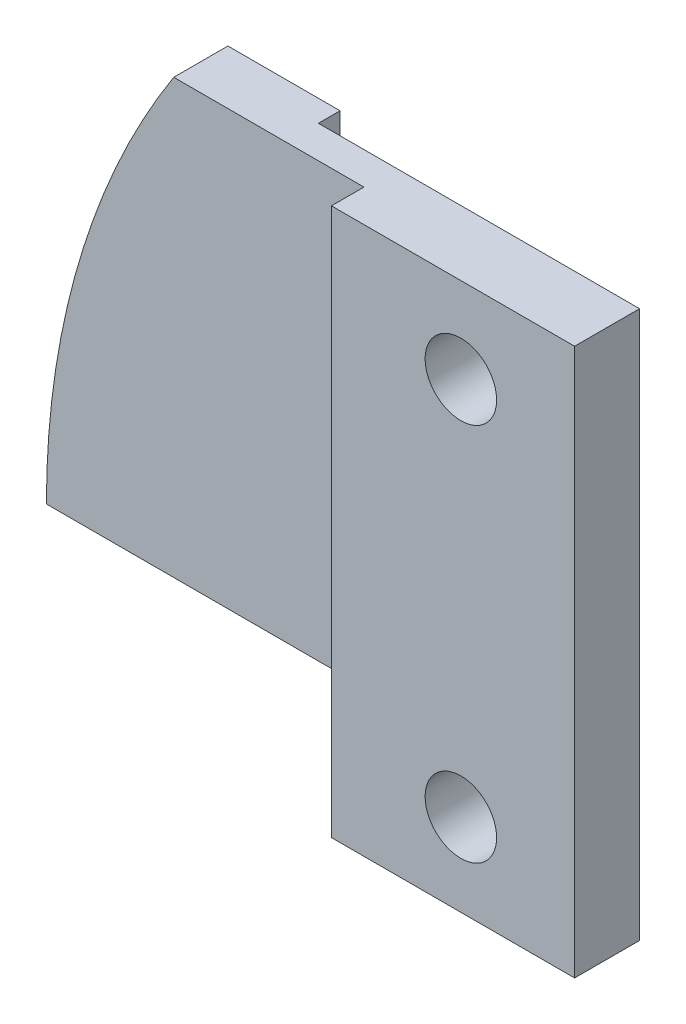
ISO-10303-21;
HEADER;
FILE_DESCRIPTION(('STEP AP214'),'2;1');
FILE_NAME('part.step','',(''),(''),'','','');
FILE_SCHEMA(('AUTOMOTIVE_DESIGN { 1 0 10303 214 1 1 1 1 }'));
ENDSEC;
DATA;
#1=APPLICATION_CONTEXT('core data for automotive mechanical design processes');
#2=APPLICATION_PROTOCOL_DEFINITION('international standard','automotive_design',2000,#1);
#3=PRODUCT_CONTEXT('',#1,'mechanical');
#4=PRODUCT('Part','Part','',(#3));
#5=PRODUCT_RELATED_PRODUCT_CATEGORY('part','',(#4));
#6=PRODUCT_DEFINITION_FORMATION('','',#4);
#7=PRODUCT_DEFINITION_CONTEXT('part definition',#1,'design');
#8=PRODUCT_DEFINITION('design','',#6,#7);
#9=PRODUCT_DEFINITION_SHAPE('','',#8);
#10=(LENGTH_UNIT() NAMED_UNIT(*) SI_UNIT(.MILLI.,.METRE.));
#11=(NAMED_UNIT(*) PLANE_ANGLE_UNIT() SI_UNIT($,.RADIAN.));
#12=(NAMED_UNIT(*) SI_UNIT($,.STERADIAN.) SOLID_ANGLE_UNIT());
#13=UNCERTAINTY_MEASURE_WITH_UNIT(LENGTH_MEASURE(1.E-05),#10,'distance_accuracy_value','');
#14=(GEOMETRIC_REPRESENTATION_CONTEXT(3) GLOBAL_UNCERTAINTY_ASSIGNED_CONTEXT((#13)) GLOBAL_UNIT_ASSIGNED_CONTEXT((#10,
#11,#12)) REPRESENTATION_CONTEXT('',''));
#15=CARTESIAN_POINT('',(0.,0.,0.));
#16=DIRECTION('',(0.,0.,1.));
#17=DIRECTION('',(1.,0.,0.));
#18=AXIS2_PLACEMENT_3D('',#15,#16,#17);
#19=CARTESIAN_POINT('',(0.775731814030067,0.,2.5));
#20=DIRECTION('',(1.,0.,0.));
#21=DIRECTION('',(0.,1.,0.));
#22=AXIS2_PLACEMENT_3D('',#19,#20,#21);
#23=PLANE('',#22);
#24=DIRECTION('',(0.,1.,0.));
#25=VECTOR('',#24,1.);
#26=CARTESIAN_POINT('',(0.775731814030068,-2.,1.));
#27=LINE('',#26,#25);
#28=CARTESIAN_POINT('',(0.775731814030068,-2.,1.));
#29=VERTEX_POINT('',#28);
#30=CARTESIAN_POINT('',(0.775731814030067,3.25769141997411,1.));
#31=VERTEX_POINT('',#30);
#32=EDGE_CURVE('E162',#29,#31,#27,.T.);
#33=ORIENTED_EDGE('',*,*,#32,.F.);
#34=DIRECTION('',(0.,0.,-1.));
#35=VECTOR('',#34,1.);
#36=CARTESIAN_POINT('',(0.775731814030068,-2.,2.5));
#37=LINE('',#36,#35);
#38=CARTESIAN_POINT('',(0.775731814030068,-2.,4.));
#39=VERTEX_POINT('',#38);
#40=EDGE_CURVE('E147',#39,#29,#37,.T.);
#41=ORIENTED_EDGE('',*,*,#40,.F.);
#42=DIRECTION('',(0.,-1.,0.));
#43=VECTOR('',#42,1.);
#44=CARTESIAN_POINT('',(0.775731814030068,-2.,4.));
#45=LINE('',#44,#43);
#46=CARTESIAN_POINT('',(0.775731814030067,23.2576914199741,4.));
#47=VERTEX_POINT('',#46);
#48=EDGE_CURVE('E200',#47,#39,#45,.T.);
#49=ORIENTED_EDGE('',*,*,#48,.F.);
#50=DIRECTION('',(0.,0.,-1.));
#51=VECTOR('',#50,1.);
#52=CARTESIAN_POINT('',(0.775731814030067,23.2576914199741,4.));
#53=LINE('',#52,#51);
#54=CARTESIAN_POINT('',(0.775731814030067,23.2576914199741,2.5));
#55=VERTEX_POINT('',#54);
#56=EDGE_CURVE('E213',#47,#55,#53,.T.);
#57=ORIENTED_EDGE('',*,*,#56,.T.);
#58=DIRECTION('',(0.,-1.,0.));
#59=VECTOR('',#58,1.);
#60=CARTESIAN_POINT('',(0.775731814030067,3.25769141997411,2.5));
#61=LINE('',#60,#59);
#62=CARTESIAN_POINT('',(0.775731814030067,3.25769141997411,2.5));
#63=VERTEX_POINT('',#62);
#64=EDGE_CURVE('E70',#55,#63,#61,.T.);
#65=ORIENTED_EDGE('',*,*,#64,.T.);
#66=DIRECTION('',(0.,0.,-1.));
#67=VECTOR('',#66,1.);
#68=CARTESIAN_POINT('',(0.775731814030067,3.25769141997411,2.5));
#69=LINE('',#68,#67);
#70=EDGE_CURVE('E55',#63,#31,#69,.T.);
#71=ORIENTED_EDGE('',*,*,#70,.T.);
#72=EDGE_LOOP('',(#33,#41,#49,#57,#65,#71));
#73=FACE_BOUND('',#72,.T.);
#74=ADVANCED_FACE('F45',(#73),#23,.F.);
#75=CARTESIAN_POINT('',(0.775731814030068,-2.,2.5));
#76=DIRECTION('',(0.,1.,0.));
#77=DIRECTION('',(-1.,0.,0.));
#78=AXIS2_PLACEMENT_3D('',#75,#76,#77);
#79=PLANE('',#78);
#80=DIRECTION('',(-1.,0.,0.));
#81=VECTOR('',#80,1.);
#82=CARTESIAN_POINT('',(12.,-2.,1.));
#83=LINE('',#82,#81);
#84=CARTESIAN_POINT('',(12.,-2.,1.));
#85=VERTEX_POINT('',#84);
#86=EDGE_CURVE('E135',#85,#29,#83,.T.);
#87=ORIENTED_EDGE('',*,*,#86,.F.);
#88=DIRECTION('',(0.,0.,-1.));
#89=VECTOR('',#88,1.);
#90=CARTESIAN_POINT('',(12.,-2.,2.5));
#91=LINE('',#90,#89);
#92=CARTESIAN_POINT('',(12.,-2.,4.));
#93=VERTEX_POINT('',#92);
#94=EDGE_CURVE('E133',#93,#85,#91,.T.);
#95=ORIENTED_EDGE('',*,*,#94,.F.);
#96=DIRECTION('',(1.,0.,0.));
#97=VECTOR('',#96,1.);
#98=CARTESIAN_POINT('',(12.,-2.,4.));
#99=LINE('',#98,#97);
#100=EDGE_CURVE('E204',#39,#93,#99,.T.);
#101=ORIENTED_EDGE('',*,*,#100,.F.);
#102=ORIENTED_EDGE('',*,*,#40,.T.);
#103=EDGE_LOOP('',(#87,#95,#101,#102));
#104=FACE_BOUND('',#103,.T.);
#105=ADVANCED_FACE('F257',(#104),#79,.F.);
#106=CARTESIAN_POINT('',(12.,23.2576914199741,2.5));
#107=DIRECTION('',(-1.,0.,0.));
#108=DIRECTION('',(0.,0.,1.));
#109=AXIS2_PLACEMENT_3D('',#106,#107,#108);
#110=PLANE('',#109);
#111=DIRECTION('',(0.,-1.,0.));
#112=VECTOR('',#111,1.);
#113=CARTESIAN_POINT('',(12.,23.2576914199741,1.));
#114=LINE('',#113,#112);
#115=CARTESIAN_POINT('',(12.,23.2576914199741,1.));
#116=VERTEX_POINT('',#115);
#117=EDGE_CURVE('E119',#116,#85,#114,.T.);
#118=ORIENTED_EDGE('',*,*,#117,.F.);
#119=DIRECTION('',(0.,0.,-1.));
#120=VECTOR('',#119,1.);
#121=CARTESIAN_POINT('',(12.,23.2576914199741,2.5));
#122=LINE('',#121,#120);
#123=CARTESIAN_POINT('',(12.,23.2576914199741,4.));
#124=VERTEX_POINT('',#123);
#125=EDGE_CURVE('E131',#124,#116,#122,.T.);
#126=ORIENTED_EDGE('',*,*,#125,.F.);
#127=DIRECTION('',(0.,1.,0.));
#128=VECTOR('',#127,1.);
#129=CARTESIAN_POINT('',(12.,23.2576914199741,4.));
#130=LINE('',#129,#128);
#131=EDGE_CURVE('E208',#93,#124,#130,.T.);
#132=ORIENTED_EDGE('',*,*,#131,.F.);
#133=ORIENTED_EDGE('',*,*,#94,.T.);
#134=EDGE_LOOP('',(#118,#126,#132,#133));
#135=FACE_BOUND('',#134,.T.);
#136=ADVANCED_FACE('F129',(#135),#110,.F.);
#137=CARTESIAN_POINT('',(6.74921920985469,19.3061015005349,2.5));
#138=DIRECTION('',(0.,0.,-1.));
#139=DIRECTION('',(-1.,0.,0.));
#140=AXIS2_PLACEMENT_3D('',#137,#138,#139);
#141=CYLINDRICAL_SURFACE('',#140,1.65);
#142=CARTESIAN_POINT('',(6.74921920985469,19.3061015005349,4.));
#143=DIRECTION('',(0.,0.,1.));
#144=DIRECTION('',(1.,0.,0.));
#145=AXIS2_PLACEMENT_3D('',#142,#143,#144);
#146=CIRCLE('',#145,1.65);
#147=CARTESIAN_POINT('',(8.39921920985469,19.3061015005349,4.));
#148=VERTEX_POINT('',#147);
#149=EDGE_CURVE('E196',#148,#148,#146,.T.);
#150=ORIENTED_EDGE('',*,*,#149,.T.);
#151=EDGE_LOOP('',(#150));
#152=FACE_BOUND('',#151,.T.);
#153=CARTESIAN_POINT('',(6.74921920985469,19.3061015005349,1.));
#154=DIRECTION('',(0.,0.,-1.));
#155=DIRECTION('',(-1.,0.,0.));
#156=AXIS2_PLACEMENT_3D('',#153,#154,#155);
#157=CIRCLE('',#156,1.65);
#158=CARTESIAN_POINT('',(5.09921920985469,19.3061015005349,1.));
#159=VERTEX_POINT('',#158);
#160=EDGE_CURVE('E188',#159,#159,#157,.T.);
#161=ORIENTED_EDGE('',*,*,#160,.T.);
#162=EDGE_LOOP('',(#161));
#163=FACE_BOUND('',#162,.T.);
#164=ADVANCED_FACE('F283',(#152,#163),#141,.F.);
#165=CARTESIAN_POINT('',(6.74921920985468,1.80610150053489,2.5));
#166=DIRECTION('',(0.,0.,-1.));
#167=DIRECTION('',(-1.,0.,0.));
#168=AXIS2_PLACEMENT_3D('',#165,#166,#167);
#169=CYLINDRICAL_SURFACE('',#168,1.65);
#170=CARTESIAN_POINT('',(6.74921920985468,1.80610150053489,4.));
#171=DIRECTION('',(0.,0.,1.));
#172=DIRECTION('',(1.,0.,0.));
#173=AXIS2_PLACEMENT_3D('',#170,#171,#172);
#174=CIRCLE('',#173,1.65);
#175=CARTESIAN_POINT('',(8.39921920985469,1.80610150053489,4.));
#176=VERTEX_POINT('',#175);
#177=EDGE_CURVE('E192',#176,#176,#174,.T.);
#178=ORIENTED_EDGE('',*,*,#177,.T.);
#179=EDGE_LOOP('',(#178));
#180=FACE_BOUND('',#179,.T.);
#181=CARTESIAN_POINT('',(6.74921920985468,1.80610150053489,1.));
#182=DIRECTION('',(0.,0.,-1.));
#183=DIRECTION('',(-1.,0.,0.));
#184=AXIS2_PLACEMENT_3D('',#181,#182,#183);
#185=CIRCLE('',#184,1.65);
#186=CARTESIAN_POINT('',(5.09921920985468,1.80610150053489,1.));
#187=VERTEX_POINT('',#186);
#188=EDGE_CURVE('E49',#187,#187,#185,.T.);
#189=ORIENTED_EDGE('',*,*,#188,.T.);
#190=EDGE_LOOP('',(#189));
#191=FACE_BOUND('',#190,.T.);
#192=ADVANCED_FACE('F279',(#180,#191),#169,.F.);
#193=CARTESIAN_POINT('',(23.0809539533338,3.25769141997411,2.5));
#194=DIRECTION('',(0.,0.,-1.));
#195=DIRECTION('',(-1.,0.,0.));
#196=AXIS2_PLACEMENT_3D('',#193,#194,#195);
#197=PLANE('',#196);
#198=ORIENTED_EDGE('',*,*,#64,.F.);
#199=DIRECTION('',(-1.,0.,0.));
#200=VECTOR('',#199,1.);
#201=CARTESIAN_POINT('',(-8.00455329736466,23.2576914199741,2.5));
#202=LINE('',#201,#200);
#203=CARTESIAN_POINT('',(-8.00455329736466,23.2576914199741,2.5));
#204=VERTEX_POINT('',#203);
#205=EDGE_CURVE('E150',#55,#204,#202,.T.);
#206=ORIENTED_EDGE('',*,*,#205,.T.);
#207=CARTESIAN_POINT('',(23.0809539533338,3.25769141997411,2.5));
#208=DIRECTION('',(0.,0.,1.));
#209=DIRECTION('',(-1.,0.,0.));
#210=AXIS2_PLACEMENT_3D('',#207,#208,#209);
#211=CIRCLE('',#210,36.9636140147744);
#212=CARTESIAN_POINT('',(-13.8826600614406,3.25769141997411,2.5));
#213=VERTEX_POINT('',#212);
#214=EDGE_CURVE('E219',#204,#213,#211,.T.);
#215=ORIENTED_EDGE('',*,*,#214,.T.);
#216=DIRECTION('',(1.,0.,0.));
#217=VECTOR('',#216,1.);
#218=CARTESIAN_POINT('',(-13.8826600614406,3.25769141997411,2.5));
#219=LINE('',#218,#217);
#220=EDGE_CURVE('E168',#213,#63,#219,.T.);
#221=ORIENTED_EDGE('',*,*,#220,.T.);
#222=EDGE_LOOP('',(#198,#206,#215,#221));
#223=FACE_BOUND('',#222,.T.);
#224=ADVANCED_FACE('F274',(#223),#197,.F.);
#225=CARTESIAN_POINT('',(23.0809539533338,3.25769141997411,0.));
#226=DIRECTION('',(0.,0.,-1.));
#227=DIRECTION('',(-1.,0.,0.));
#228=AXIS2_PLACEMENT_3D('',#225,#226,#227);
#229=PLANE('',#228);
#230=DIRECTION('',(0.,1.,0.));
#231=VECTOR('',#230,1.);
#232=CARTESIAN_POINT('',(-2.82666101060396,3.25769141997411,0.));
#233=LINE('',#232,#231);
#234=CARTESIAN_POINT('',(-2.82666101060396,3.25769141997411,0.));
#235=VERTEX_POINT('',#234);
#236=CARTESIAN_POINT('',(-2.82666101060396,23.2576914199741,0.));
#237=VERTEX_POINT('',#236);
#238=EDGE_CURVE('E125',#235,#237,#233,.T.);
#239=ORIENTED_EDGE('',*,*,#238,.F.);
#240=DIRECTION('',(1.,0.,0.));
#241=VECTOR('',#240,1.);
#242=CARTESIAN_POINT('',(-13.8826600614406,3.25769141997411,0.));
#243=LINE('',#242,#241);
#244=CARTESIAN_POINT('',(-13.8826600614406,3.25769141997411,0.));
#245=VERTEX_POINT('',#244);
#246=EDGE_CURVE('E230',#245,#235,#243,.T.);
#247=ORIENTED_EDGE('',*,*,#246,.F.);
#248=CARTESIAN_POINT('',(23.0809539533338,3.25769141997411,0.));
#249=DIRECTION('',(0.,0.,1.));
#250=DIRECTION('',(-1.,0.,0.));
#251=AXIS2_PLACEMENT_3D('',#248,#249,#250);
#252=CIRCLE('',#251,36.9636140147744);
#253=CARTESIAN_POINT('',(-8.00455329736466,23.2576914199741,0.));
#254=VERTEX_POINT('',#253);
#255=EDGE_CURVE('E218',#254,#245,#252,.T.);
#256=ORIENTED_EDGE('',*,*,#255,.F.);
#257=DIRECTION('',(-1.,0.,0.));
#258=VECTOR('',#257,1.);
#259=CARTESIAN_POINT('',(-8.00455329736466,23.2576914199741,0.));
#260=LINE('',#259,#258);
#261=EDGE_CURVE('E222',#237,#254,#260,.T.);
#262=ORIENTED_EDGE('',*,*,#261,.F.);
#263=EDGE_LOOP('',(#239,#247,#256,#262));
#264=FACE_BOUND('',#263,.T.);
#265=ADVANCED_FACE('F241',(#264),#229,.T.);
#266=CARTESIAN_POINT('',(23.0809539533338,3.25769141997411,2.5));
#267=DIRECTION('',(0.,0.,-1.));
#268=DIRECTION('',(-1.,0.,0.));
#269=AXIS2_PLACEMENT_3D('',#266,#267,#268);
#270=CYLINDRICAL_SURFACE('',#269,36.9636140147744);
#271=ORIENTED_EDGE('',*,*,#255,.T.);
#272=DIRECTION('',(0.,0.,-1.));
#273=VECTOR('',#272,1.);
#274=CARTESIAN_POINT('',(-13.8826600614406,3.25769141997411,2.5));
#275=LINE('',#274,#273);
#276=EDGE_CURVE('E11',#213,#245,#275,.T.);
#277=ORIENTED_EDGE('',*,*,#276,.F.);
#278=ORIENTED_EDGE('',*,*,#214,.F.);
#279=DIRECTION('',(0.,0.,-1.));
#280=VECTOR('',#279,1.);
#281=CARTESIAN_POINT('',(-8.00455329736466,23.2576914199741,2.5));
#282=LINE('',#281,#280);
#283=EDGE_CURVE('E143',#204,#254,#282,.T.);
#284=ORIENTED_EDGE('',*,*,#283,.T.);
#285=EDGE_LOOP('',(#271,#277,#278,#284));
#286=FACE_BOUND('',#285,.T.);
#287=ADVANCED_FACE('F47',(#286),#270,.T.);
#288=CARTESIAN_POINT('',(-13.8826600614406,3.25769141997411,2.5));
#289=DIRECTION('',(0.,1.,0.));
#290=DIRECTION('',(0.,0.,1.));
#291=AXIS2_PLACEMENT_3D('',#288,#289,#290);
#292=PLANE('',#291);
#293=ORIENTED_EDGE('',*,*,#246,.T.);
#294=DIRECTION('',(0.,0.,-1.));
#295=VECTOR('',#294,1.);
#296=CARTESIAN_POINT('',(-2.82666101060396,3.25769141997411,1.));
#297=LINE('',#296,#295);
#298=CARTESIAN_POINT('',(-2.82666101060396,3.25769141997411,1.));
#299=VERTEX_POINT('',#298);
#300=EDGE_CURVE('E172',#299,#235,#297,.T.);
#301=ORIENTED_EDGE('',*,*,#300,.F.);
#302=DIRECTION('',(-1.,0.,0.));
#303=VECTOR('',#302,1.);
#304=CARTESIAN_POINT('',(0.775731814030067,3.25769141997411,1.));
#305=LINE('',#304,#303);
#306=EDGE_CURVE('E171',#31,#299,#305,.T.);
#307=ORIENTED_EDGE('',*,*,#306,.F.);
#308=ORIENTED_EDGE('',*,*,#70,.F.);
#309=ORIENTED_EDGE('',*,*,#220,.F.);
#310=ORIENTED_EDGE('',*,*,#276,.T.);
#311=EDGE_LOOP('',(#293,#301,#307,#308,#309,#310));
#312=FACE_BOUND('',#311,.T.);
#313=ADVANCED_FACE('F167',(#312),#292,.F.);
#314=CARTESIAN_POINT('',(-8.00455329736466,23.2576914199741,2.5));
#315=DIRECTION('',(0.,-1.,0.));
#316=DIRECTION('',(0.,0.,-1.));
#317=AXIS2_PLACEMENT_3D('',#314,#315,#316);
#318=PLANE('',#317);
#319=DIRECTION('',(1.,0.,0.));
#320=VECTOR('',#319,1.);
#321=CARTESIAN_POINT('',(-2.82666101060396,23.2576914199741,1.));
#322=LINE('',#321,#320);
#323=CARTESIAN_POINT('',(-2.82666101060396,23.2576914199741,1.));
#324=VERTEX_POINT('',#323);
#325=EDGE_CURVE('E116',#324,#116,#322,.T.);
#326=ORIENTED_EDGE('',*,*,#325,.F.);
#327=DIRECTION('',(0.,0.,-1.));
#328=VECTOR('',#327,1.);
#329=CARTESIAN_POINT('',(-2.82666101060396,23.2576914199741,1.));
#330=LINE('',#329,#328);
#331=EDGE_CURVE('E183',#324,#237,#330,.T.);
#332=ORIENTED_EDGE('',*,*,#331,.T.);
#333=ORIENTED_EDGE('',*,*,#261,.T.);
#334=ORIENTED_EDGE('',*,*,#283,.F.);
#335=ORIENTED_EDGE('',*,*,#205,.F.);
#336=ORIENTED_EDGE('',*,*,#56,.F.);
#337=DIRECTION('',(-1.,0.,0.));
#338=VECTOR('',#337,1.);
#339=CARTESIAN_POINT('',(0.775731814030067,23.2576914199741,4.));
#340=LINE('',#339,#338);
#341=EDGE_CURVE('E141',#124,#47,#340,.T.);
#342=ORIENTED_EDGE('',*,*,#341,.F.);
#343=ORIENTED_EDGE('',*,*,#125,.T.);
#344=EDGE_LOOP('',(#326,#332,#333,#334,#335,#336,#342,#343));
#345=FACE_BOUND('',#344,.T.);
#346=ADVANCED_FACE('F138',(#345),#318,.F.);
#347=CARTESIAN_POINT('',(0.,0.,4.));
#348=DIRECTION('',(0.,0.,-1.));
#349=DIRECTION('',(-1.,0.,0.));
#350=AXIS2_PLACEMENT_3D('',#347,#348,#349);
#351=PLANE('',#350);
#352=ORIENTED_EDGE('',*,*,#48,.T.);
#353=ORIENTED_EDGE('',*,*,#100,.T.);
#354=ORIENTED_EDGE('',*,*,#131,.T.);
#355=ORIENTED_EDGE('',*,*,#341,.T.);
#356=EDGE_LOOP('',(#352,#353,#354,#355));
#357=FACE_BOUND('',#356,.T.);
#358=ORIENTED_EDGE('',*,*,#149,.F.);
#359=EDGE_LOOP('',(#358));
#360=FACE_BOUND('',#359,.T.);
#361=ORIENTED_EDGE('',*,*,#177,.F.);
#362=EDGE_LOOP('',(#361));
#363=FACE_BOUND('',#362,.T.);
#364=ADVANCED_FACE('F245',(#357,#360,#363),#351,.F.);
#365=CARTESIAN_POINT('',(-2.82666101060396,3.25769141997411,1.));
#366=DIRECTION('',(-1.,0.,0.));
#367=DIRECTION('',(0.,0.,1.));
#368=AXIS2_PLACEMENT_3D('',#365,#366,#367);
#369=PLANE('',#368);
#370=ORIENTED_EDGE('',*,*,#238,.T.);
#371=ORIENTED_EDGE('',*,*,#331,.F.);
#372=DIRECTION('',(0.,1.,0.));
#373=VECTOR('',#372,1.);
#374=CARTESIAN_POINT('',(-2.82666101060396,3.25769141997411,1.));
#375=LINE('',#374,#373);
#376=EDGE_CURVE('E62',#299,#324,#375,.T.);
#377=ORIENTED_EDGE('',*,*,#376,.F.);
#378=ORIENTED_EDGE('',*,*,#300,.T.);
#379=EDGE_LOOP('',(#370,#371,#377,#378));
#380=FACE_BOUND('',#379,.T.);
#381=ADVANCED_FACE('F243',(#380),#369,.F.);
#382=CARTESIAN_POINT('',(0.,0.,1.));
#383=DIRECTION('',(0.,0.,-1.));
#384=DIRECTION('',(-1.,0.,0.));
#385=AXIS2_PLACEMENT_3D('',#382,#383,#384);
#386=PLANE('',#385);
#387=ORIENTED_EDGE('',*,*,#160,.F.);
#388=EDGE_LOOP('',(#387));
#389=FACE_BOUND('',#388,.T.);
#390=ORIENTED_EDGE('',*,*,#188,.F.);
#391=EDGE_LOOP('',(#390));
#392=FACE_BOUND('',#391,.T.);
#393=ORIENTED_EDGE('',*,*,#325,.T.);
#394=ORIENTED_EDGE('',*,*,#117,.T.);
#395=ORIENTED_EDGE('',*,*,#86,.T.);
#396=ORIENTED_EDGE('',*,*,#32,.T.);
#397=ORIENTED_EDGE('',*,*,#306,.T.);
#398=ORIENTED_EDGE('',*,*,#376,.T.);
#399=EDGE_LOOP('',(#393,#394,#395,#396,#397,#398));
#400=FACE_BOUND('',#399,.T.);
#401=ADVANCED_FACE('F118',(#389,#392,#400),#386,.T.);
#402=CLOSED_SHELL('',(#74,#105,#136,#164,#192,#224,#265,#287,#313,#346,#364,#381,#401));
#403=MANIFOLD_SOLID_BREP('B2',#402);
#404=ADVANCED_BREP_SHAPE_REPRESENTATION('',(#18,#403),#14);
#405=SHAPE_DEFINITION_REPRESENTATION(#9,#404);
ENDSEC;
END-ISO-10303-21;
